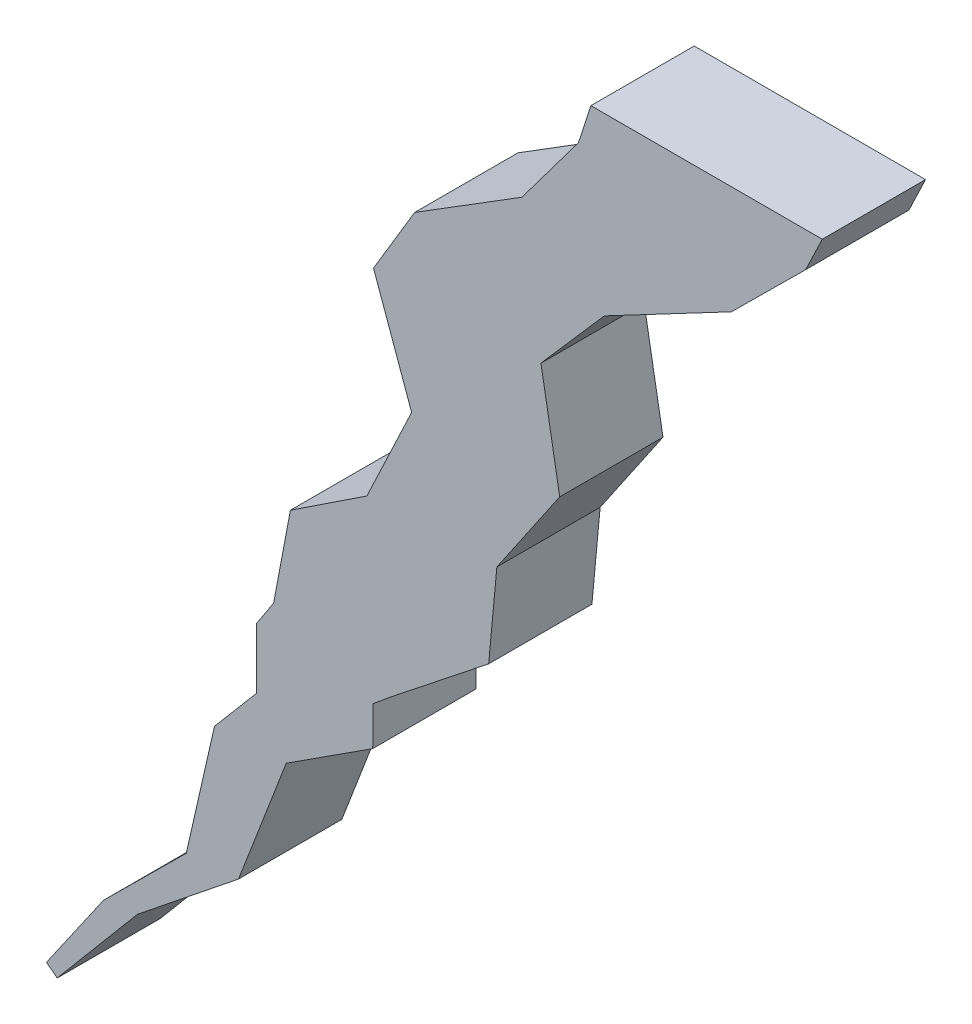
ISO-10303-21;
HEADER;
FILE_DESCRIPTION(('STEP AP214'),'2;1');
FILE_NAME('part.step','',(''),(''),'','','');
FILE_SCHEMA(('AUTOMOTIVE_DESIGN { 1 0 10303 214 1 1 1 1 }'));
ENDSEC;
DATA;
#1=APPLICATION_CONTEXT('core data for automotive mechanical design processes');
#2=APPLICATION_PROTOCOL_DEFINITION('international standard','automotive_design',2000,#1);
#3=PRODUCT_CONTEXT('',#1,'mechanical');
#4=PRODUCT('Part','Part','',(#3));
#5=PRODUCT_RELATED_PRODUCT_CATEGORY('part','',(#4));
#6=PRODUCT_DEFINITION_FORMATION('','',#4);
#7=PRODUCT_DEFINITION_CONTEXT('part definition',#1,'design');
#8=PRODUCT_DEFINITION('design','',#6,#7);
#9=PRODUCT_DEFINITION_SHAPE('','',#8);
#10=(LENGTH_UNIT() NAMED_UNIT(*) SI_UNIT(.MILLI.,.METRE.));
#11=(NAMED_UNIT(*) PLANE_ANGLE_UNIT() SI_UNIT($,.RADIAN.));
#12=(NAMED_UNIT(*) SI_UNIT($,.STERADIAN.) SOLID_ANGLE_UNIT());
#13=UNCERTAINTY_MEASURE_WITH_UNIT(LENGTH_MEASURE(1.E-05),#10,'distance_accuracy_value','');
#14=(GEOMETRIC_REPRESENTATION_CONTEXT(3) GLOBAL_UNCERTAINTY_ASSIGNED_CONTEXT((#13)) GLOBAL_UNIT_ASSIGNED_CONTEXT((#10,
#11,#12)) REPRESENTATION_CONTEXT('',''));
#15=CARTESIAN_POINT('',(0.,0.,0.));
#16=DIRECTION('',(0.,0.,1.));
#17=DIRECTION('',(1.,0.,0.));
#18=AXIS2_PLACEMENT_3D('',#15,#16,#17);
#19=CARTESIAN_POINT('',(15.949772023795,29.831204,3.));
#20=DIRECTION('',(0.,-1.,0.));
#21=DIRECTION('',(0.,0.,-1.));
#22=AXIS2_PLACEMENT_3D('',#19,#20,#21);
#23=PLANE('',#22);
#24=DIRECTION('',(-1.,0.,0.));
#25=VECTOR('',#24,1.);
#26=CARTESIAN_POINT('',(15.949772023795,29.831204,0.));
#27=LINE('',#26,#25);
#28=CARTESIAN_POINT('',(22.6696081865461,29.831204,0.));
#29=VERTEX_POINT('',#28);
#30=CARTESIAN_POINT('',(15.949772023795,29.831204,0.));
#31=VERTEX_POINT('',#30);
#32=EDGE_CURVE('E261',#29,#31,#27,.T.);
#33=ORIENTED_EDGE('',*,*,#32,.T.);
#34=DIRECTION('',(0.,0.,-1.));
#35=VECTOR('',#34,1.);
#36=CARTESIAN_POINT('',(15.949772023795,29.831204,3.));
#37=LINE('',#36,#35);
#38=CARTESIAN_POINT('',(15.949772023795,29.831204,3.));
#39=VERTEX_POINT('',#38);
#40=EDGE_CURVE('E11',#39,#31,#37,.T.);
#41=ORIENTED_EDGE('',*,*,#40,.F.);
#42=DIRECTION('',(-1.,0.,0.));
#43=VECTOR('',#42,1.);
#44=CARTESIAN_POINT('',(15.949772023795,29.831204,3.));
#45=LINE('',#44,#43);
#46=CARTESIAN_POINT('',(22.6696081865461,29.831204,3.));
#47=VERTEX_POINT('',#46);
#48=EDGE_CURVE('E319',#47,#39,#45,.T.);
#49=ORIENTED_EDGE('',*,*,#48,.F.);
#50=DIRECTION('',(0.,0.,-1.));
#51=VECTOR('',#50,1.);
#52=CARTESIAN_POINT('',(22.6696081865461,29.831204,3.));
#53=LINE('',#52,#51);
#54=EDGE_CURVE('E257',#47,#29,#53,.T.);
#55=ORIENTED_EDGE('',*,*,#54,.T.);
#56=EDGE_LOOP('',(#33,#41,#49,#55));
#57=FACE_BOUND('',#56,.T.);
#58=ADVANCED_FACE('F33',(#57),#23,.F.);
#59=CARTESIAN_POINT('',(15.5877255705261,28.7178437122339,3.));
#60=DIRECTION('',(0.950982744946045,-0.309243947094984,0.));
#61=DIRECTION('',(0.309243947094984,0.950982744946045,0.));
#62=AXIS2_PLACEMENT_3D('',#59,#60,#61);
#63=PLANE('',#62);
#64=DIRECTION('',(-0.309243947094984,-0.950982744946045,0.));
#65=VECTOR('',#64,1.);
#66=CARTESIAN_POINT('',(15.5877255705261,28.7178437122339,0.));
#67=LINE('',#66,#65);
#68=CARTESIAN_POINT('',(15.5877255705261,28.7178437122339,0.));
#69=VERTEX_POINT('',#68);
#70=EDGE_CURVE('E264',#31,#69,#67,.T.);
#71=ORIENTED_EDGE('',*,*,#70,.T.);
#72=DIRECTION('',(0.,0.,-1.));
#73=VECTOR('',#72,1.);
#74=CARTESIAN_POINT('',(15.5877255705261,28.7178437122339,3.));
#75=LINE('',#74,#73);
#76=CARTESIAN_POINT('',(15.5877255705261,28.7178437122339,3.));
#77=VERTEX_POINT('',#76);
#78=EDGE_CURVE('E41',#77,#69,#75,.T.);
#79=ORIENTED_EDGE('',*,*,#78,.F.);
#80=DIRECTION('',(-0.309243947094984,-0.950982744946045,0.));
#81=VECTOR('',#80,1.);
#82=CARTESIAN_POINT('',(15.5877255705261,28.7178437122339,3.));
#83=LINE('',#82,#81);
#84=EDGE_CURVE('E158',#39,#77,#83,.T.);
#85=ORIENTED_EDGE('',*,*,#84,.F.);
#86=ORIENTED_EDGE('',*,*,#40,.T.);
#87=EDGE_LOOP('',(#71,#79,#85,#86));
#88=FACE_BOUND('',#87,.T.);
#89=ADVANCED_FACE('F487',(#88),#63,.F.);
#90=CARTESIAN_POINT('',(13.9488355878805,26.5276676371434,3.));
#91=DIRECTION('',(0.800656150724203,-0.599124134305657,0.));
#92=DIRECTION('',(0.599124134305657,0.800656150724203,0.));
#93=AXIS2_PLACEMENT_3D('',#90,#91,#92);
#94=PLANE('',#93);
#95=DIRECTION('',(-0.599124134305657,-0.800656150724203,0.));
#96=VECTOR('',#95,1.);
#97=CARTESIAN_POINT('',(13.9488355878805,26.5276676371434,0.));
#98=LINE('',#97,#96);
#99=CARTESIAN_POINT('',(13.9488355878805,26.5276676371434,0.));
#100=VERTEX_POINT('',#99);
#101=EDGE_CURVE('E266',#69,#100,#98,.T.);
#102=ORIENTED_EDGE('',*,*,#101,.T.);
#103=DIRECTION('',(0.,0.,-1.));
#104=VECTOR('',#103,1.);
#105=CARTESIAN_POINT('',(13.9488355878805,26.5276676371434,3.));
#106=LINE('',#105,#104);
#107=CARTESIAN_POINT('',(13.9488355878805,26.5276676371434,3.));
#108=VERTEX_POINT('',#107);
#109=EDGE_CURVE('E392',#108,#100,#106,.T.);
#110=ORIENTED_EDGE('',*,*,#109,.F.);
#111=DIRECTION('',(-0.599124134305657,-0.800656150724203,0.));
#112=VECTOR('',#111,1.);
#113=CARTESIAN_POINT('',(13.9488355878805,26.5276676371434,3.));
#114=LINE('',#113,#112);
#115=EDGE_CURVE('E400',#77,#108,#114,.T.);
#116=ORIENTED_EDGE('',*,*,#115,.F.);
#117=ORIENTED_EDGE('',*,*,#78,.T.);
#118=EDGE_LOOP('',(#102,#110,#116,#117));
#119=FACE_BOUND('',#118,.T.);
#120=ADVANCED_FACE('F398',(#119),#94,.F.);
#121=CARTESIAN_POINT('',(10.8314122240594,24.5853584851001,3.));
#122=DIRECTION('',(0.528807983663958,-0.848741489744232,0.));
#123=DIRECTION('',(0.848741489744233,0.528807983663958,0.));
#124=AXIS2_PLACEMENT_3D('',#121,#122,#123);
#125=PLANE('',#124);
#126=DIRECTION('',(-0.848741489744233,-0.528807983663958,0.));
#127=VECTOR('',#126,1.);
#128=CARTESIAN_POINT('',(10.8314122240594,24.5853584851001,0.));
#129=LINE('',#128,#127);
#130=CARTESIAN_POINT('',(10.8314122240594,24.5853584851001,0.));
#131=VERTEX_POINT('',#130);
#132=EDGE_CURVE('E268',#100,#131,#129,.T.);
#133=ORIENTED_EDGE('',*,*,#132,.T.);
#134=DIRECTION('',(0.,0.,-1.));
#135=VECTOR('',#134,1.);
#136=CARTESIAN_POINT('',(10.8314122240594,24.5853584851001,3.));
#137=LINE('',#136,#135);
#138=CARTESIAN_POINT('',(10.8314122240594,24.5853584851001,3.));
#139=VERTEX_POINT('',#138);
#140=EDGE_CURVE('E389',#139,#131,#137,.T.);
#141=ORIENTED_EDGE('',*,*,#140,.F.);
#142=DIRECTION('',(-0.848741489744233,-0.528807983663958,0.));
#143=VECTOR('',#142,1.);
#144=CARTESIAN_POINT('',(10.8314122240594,24.5853584851001,3.));
#145=LINE('',#144,#143);
#146=EDGE_CURVE('E418',#108,#139,#145,.T.);
#147=ORIENTED_EDGE('',*,*,#146,.F.);
#148=ORIENTED_EDGE('',*,*,#109,.T.);
#149=EDGE_LOOP('',(#133,#141,#147,#148));
#150=FACE_BOUND('',#149,.T.);
#151=ADVANCED_FACE('F409',(#150),#125,.F.);
#152=CARTESIAN_POINT('',(9.63595958319933,22.5881278537821,3.));
#153=DIRECTION('',(0.858039391938375,-0.51358388008389,0.));
#154=DIRECTION('',(0.51358388008389,0.858039391938375,0.));
#155=AXIS2_PLACEMENT_3D('',#152,#153,#154);
#156=PLANE('',#155);
#157=DIRECTION('',(-0.51358388008389,-0.858039391938375,0.));
#158=VECTOR('',#157,1.);
#159=CARTESIAN_POINT('',(9.63595958319933,22.5881278537821,0.));
#160=LINE('',#159,#158);
#161=CARTESIAN_POINT('',(9.63595958319933,22.5881278537821,0.));
#162=VERTEX_POINT('',#161);
#163=EDGE_CURVE('E270',#131,#162,#160,.T.);
#164=ORIENTED_EDGE('',*,*,#163,.T.);
#165=DIRECTION('',(0.,0.,-1.));
#166=VECTOR('',#165,1.);
#167=CARTESIAN_POINT('',(9.63595958319933,22.5881278537821,3.));
#168=LINE('',#167,#166);
#169=CARTESIAN_POINT('',(9.63595958319933,22.5881278537821,3.));
#170=VERTEX_POINT('',#169);
#171=EDGE_CURVE('E386',#170,#162,#168,.T.);
#172=ORIENTED_EDGE('',*,*,#171,.F.);
#173=DIRECTION('',(-0.51358388008389,-0.858039391938375,0.));
#174=VECTOR('',#173,1.);
#175=CARTESIAN_POINT('',(9.63595958319933,22.5881278537821,3.));
#176=LINE('',#175,#174);
#177=EDGE_CURVE('E415',#139,#170,#176,.T.);
#178=ORIENTED_EDGE('',*,*,#177,.F.);
#179=ORIENTED_EDGE('',*,*,#140,.T.);
#180=EDGE_LOOP('',(#164,#172,#178,#179));
#181=FACE_BOUND('',#180,.T.);
#182=ADVANCED_FACE('F413',(#181),#156,.F.);
#183=CARTESIAN_POINT('',(10.7425999469709,19.5094708641594,3.));
#184=DIRECTION('',(0.941050586311647,0.338265862898557,0.));
#185=DIRECTION('',(-0.338265862898557,0.941050586311647,0.));
#186=AXIS2_PLACEMENT_3D('',#183,#184,#185);
#187=PLANE('',#186);
#188=DIRECTION('',(0.338265862898557,-0.941050586311647,0.));
#189=VECTOR('',#188,1.);
#190=CARTESIAN_POINT('',(10.7425999469709,19.5094708641594,0.));
#191=LINE('',#190,#189);
#192=CARTESIAN_POINT('',(10.7425999469709,19.5094708641594,0.));
#193=VERTEX_POINT('',#192);
#194=EDGE_CURVE('E272',#162,#193,#191,.T.);
#195=ORIENTED_EDGE('',*,*,#194,.T.);
#196=DIRECTION('',(0.,0.,-1.));
#197=VECTOR('',#196,1.);
#198=CARTESIAN_POINT('',(10.7425999469709,19.5094708641594,3.));
#199=LINE('',#198,#197);
#200=CARTESIAN_POINT('',(10.7425999469709,19.5094708641594,3.));
#201=VERTEX_POINT('',#200);
#202=EDGE_CURVE('E383',#201,#193,#199,.T.);
#203=ORIENTED_EDGE('',*,*,#202,.F.);
#204=DIRECTION('',(0.338265862898557,-0.941050586311647,0.));
#205=VECTOR('',#204,1.);
#206=CARTESIAN_POINT('',(10.7425999469709,19.5094708641594,3.));
#207=LINE('',#206,#205);
#208=EDGE_CURVE('E417',#170,#201,#207,.T.);
#209=ORIENTED_EDGE('',*,*,#208,.F.);
#210=ORIENTED_EDGE('',*,*,#171,.T.);
#211=EDGE_LOOP('',(#195,#203,#209,#210));
#212=FACE_BOUND('',#211,.T.);
#213=ADVANCED_FACE('F500',(#212),#187,.F.);
#214=CARTESIAN_POINT('',(9.44293921269338,16.7581525376982,3.));
#215=DIRECTION('',(0.904194445301833,-0.427121066075312,0.));
#216=DIRECTION('',(0.427121066075312,0.904194445301833,0.));
#217=AXIS2_PLACEMENT_3D('',#214,#215,#216);
#218=PLANE('',#217);
#219=DIRECTION('',(-0.427121066075312,-0.904194445301833,0.));
#220=VECTOR('',#219,1.);
#221=CARTESIAN_POINT('',(9.44293921269338,16.7581525376982,0.));
#222=LINE('',#221,#220);
#223=CARTESIAN_POINT('',(9.44293921269338,16.7581525376982,0.));
#224=VERTEX_POINT('',#223);
#225=EDGE_CURVE('E274',#193,#224,#222,.T.);
#226=ORIENTED_EDGE('',*,*,#225,.T.);
#227=DIRECTION('',(0.,0.,-1.));
#228=VECTOR('',#227,1.);
#229=CARTESIAN_POINT('',(9.44293921269338,16.7581525376982,3.));
#230=LINE('',#229,#228);
#231=CARTESIAN_POINT('',(9.44293921269338,16.7581525376982,3.));
#232=VERTEX_POINT('',#231);
#233=EDGE_CURVE('E380',#232,#224,#230,.T.);
#234=ORIENTED_EDGE('',*,*,#233,.F.);
#235=DIRECTION('',(-0.427121066075312,-0.904194445301833,0.));
#236=VECTOR('',#235,1.);
#237=CARTESIAN_POINT('',(9.44293921269338,16.7581525376982,3.));
#238=LINE('',#237,#236);
#239=EDGE_CURVE('E420',#201,#232,#238,.T.);
#240=ORIENTED_EDGE('',*,*,#239,.F.);
#241=ORIENTED_EDGE('',*,*,#202,.T.);
#242=EDGE_LOOP('',(#226,#234,#240,#241));
#243=FACE_BOUND('',#242,.T.);
#244=ADVANCED_FACE('F503',(#243),#218,.F.);
#245=CARTESIAN_POINT('',(7.22140834262423,15.289524307484,3.));
#246=DIRECTION('',(0.551474477361324,-0.834191765015128,0.));
#247=DIRECTION('',(0.834191765015128,0.551474477361324,0.));
#248=AXIS2_PLACEMENT_3D('',#245,#246,#247);
#249=PLANE('',#248);
#250=DIRECTION('',(-0.834191765015128,-0.551474477361324,0.));
#251=VECTOR('',#250,1.);
#252=CARTESIAN_POINT('',(7.22140834262423,15.289524307484,0.));
#253=LINE('',#252,#251);
#254=CARTESIAN_POINT('',(7.22140834262423,15.289524307484,0.));
#255=VERTEX_POINT('',#254);
#256=EDGE_CURVE('E276',#224,#255,#253,.T.);
#257=ORIENTED_EDGE('',*,*,#256,.T.);
#258=DIRECTION('',(0.,0.,-1.));
#259=VECTOR('',#258,1.);
#260=CARTESIAN_POINT('',(7.22140834262423,15.289524307484,3.));
#261=LINE('',#260,#259);
#262=CARTESIAN_POINT('',(7.22140834262423,15.289524307484,3.));
#263=VERTEX_POINT('',#262);
#264=EDGE_CURVE('E377',#263,#255,#261,.T.);
#265=ORIENTED_EDGE('',*,*,#264,.F.);
#266=DIRECTION('',(-0.834191765015128,-0.551474477361324,0.));
#267=VECTOR('',#266,1.);
#268=CARTESIAN_POINT('',(7.22140834262423,15.289524307484,3.));
#269=LINE('',#268,#267);
#270=EDGE_CURVE('E426',#232,#263,#269,.T.);
#271=ORIENTED_EDGE('',*,*,#270,.F.);
#272=ORIENTED_EDGE('',*,*,#233,.T.);
#273=EDGE_LOOP('',(#257,#265,#271,#272));
#274=FACE_BOUND('',#273,.T.);
#275=ADVANCED_FACE('F507',(#274),#249,.F.);
#276=CARTESIAN_POINT('',(6.73470511667702,12.7105591006477,3.));
#277=DIRECTION('',(0.982654293218846,-0.185446865755586,0.));
#278=DIRECTION('',(0.185446865755586,0.982654293218846,0.));
#279=AXIS2_PLACEMENT_3D('',#276,#277,#278);
#280=PLANE('',#279);
#281=DIRECTION('',(-0.185446865755586,-0.982654293218846,0.));
#282=VECTOR('',#281,1.);
#283=CARTESIAN_POINT('',(6.73470511667702,12.7105591006477,0.));
#284=LINE('',#283,#282);
#285=CARTESIAN_POINT('',(6.73470511667702,12.7105591006477,0.));
#286=VERTEX_POINT('',#285);
#287=EDGE_CURVE('E278',#255,#286,#284,.T.);
#288=ORIENTED_EDGE('',*,*,#287,.T.);
#289=DIRECTION('',(0.,0.,-1.));
#290=VECTOR('',#289,1.);
#291=CARTESIAN_POINT('',(6.73470511667702,12.7105591006477,3.));
#292=LINE('',#291,#290);
#293=CARTESIAN_POINT('',(6.73470511667702,12.7105591006477,3.));
#294=VERTEX_POINT('',#293);
#295=EDGE_CURVE('E374',#294,#286,#292,.T.);
#296=ORIENTED_EDGE('',*,*,#295,.F.);
#297=DIRECTION('',(-0.185446865755586,-0.982654293218846,0.));
#298=VECTOR('',#297,1.);
#299=CARTESIAN_POINT('',(6.73470511667702,12.7105591006477,3.));
#300=LINE('',#299,#298);
#301=EDGE_CURVE('E428',#263,#294,#300,.T.);
#302=ORIENTED_EDGE('',*,*,#301,.F.);
#303=ORIENTED_EDGE('',*,*,#264,.T.);
#304=EDGE_LOOP('',(#288,#296,#302,#303));
#305=FACE_BOUND('',#304,.T.);
#306=ADVANCED_FACE('F511',(#305),#280,.F.);
#307=CARTESIAN_POINT('',(6.23327213099305,11.9417480705209,3.));
#308=DIRECTION('',(0.837593404417132,-0.546294141353281,0.));
#309=DIRECTION('',(0.546294141353281,0.837593404417132,0.));
#310=AXIS2_PLACEMENT_3D('',#307,#308,#309);
#311=PLANE('',#310);
#312=DIRECTION('',(-0.546294141353281,-0.837593404417132,0.));
#313=VECTOR('',#312,1.);
#314=CARTESIAN_POINT('',(6.23327213099305,11.9417480705209,0.));
#315=LINE('',#314,#313);
#316=CARTESIAN_POINT('',(6.23327213099305,11.9417480705209,0.));
#317=VERTEX_POINT('',#316);
#318=EDGE_CURVE('E280',#286,#317,#315,.T.);
#319=ORIENTED_EDGE('',*,*,#318,.T.);
#320=DIRECTION('',(0.,0.,-1.));
#321=VECTOR('',#320,1.);
#322=CARTESIAN_POINT('',(6.23327213099305,11.9417480705209,3.));
#323=LINE('',#322,#321);
#324=CARTESIAN_POINT('',(6.23327213099305,11.9417480705209,3.));
#325=VERTEX_POINT('',#324);
#326=EDGE_CURVE('E371',#325,#317,#323,.T.);
#327=ORIENTED_EDGE('',*,*,#326,.F.);
#328=DIRECTION('',(-0.546294141353281,-0.837593404417132,0.));
#329=VECTOR('',#328,1.);
#330=CARTESIAN_POINT('',(6.23327213099305,11.9417480705209,3.));
#331=LINE('',#330,#329);
#332=EDGE_CURVE('E430',#294,#325,#331,.T.);
#333=ORIENTED_EDGE('',*,*,#332,.F.);
#334=ORIENTED_EDGE('',*,*,#295,.T.);
#335=EDGE_LOOP('',(#319,#327,#333,#334));
#336=FACE_BOUND('',#335,.T.);
#337=ADVANCED_FACE('F515',(#336),#311,.F.);
#338=CARTESIAN_POINT('',(6.24148893094831,10.1973427249836,3.));
#339=DIRECTION('',(0.999988906377396,0.00471032081058944,0.));
#340=DIRECTION('',(-0.00471032081058944,0.999988906377397,0.));
#341=AXIS2_PLACEMENT_3D('',#338,#339,#340);
#342=PLANE('',#341);
#343=DIRECTION('',(0.00471032081058944,-0.999988906377396,0.));
#344=VECTOR('',#343,1.);
#345=CARTESIAN_POINT('',(6.24148893094831,10.1973427249836,0.));
#346=LINE('',#345,#344);
#347=CARTESIAN_POINT('',(6.24148893094831,10.1973427249836,0.));
#348=VERTEX_POINT('',#347);
#349=EDGE_CURVE('E282',#317,#348,#346,.T.);
#350=ORIENTED_EDGE('',*,*,#349,.T.);
#351=DIRECTION('',(0.,0.,-1.));
#352=VECTOR('',#351,1.);
#353=CARTESIAN_POINT('',(6.24148893094831,10.1973427249836,3.));
#354=LINE('',#353,#352);
#355=CARTESIAN_POINT('',(6.24148893094831,10.1973427249836,3.));
#356=VERTEX_POINT('',#355);
#357=EDGE_CURVE('E368',#356,#348,#354,.T.);
#358=ORIENTED_EDGE('',*,*,#357,.F.);
#359=DIRECTION('',(0.00471032081058944,-0.999988906377396,0.));
#360=VECTOR('',#359,1.);
#361=CARTESIAN_POINT('',(6.24148893094831,10.1973427249836,3.));
#362=LINE('',#361,#360);
#363=EDGE_CURVE('E432',#325,#356,#362,.T.);
#364=ORIENTED_EDGE('',*,*,#363,.F.);
#365=ORIENTED_EDGE('',*,*,#326,.T.);
#366=EDGE_LOOP('',(#350,#358,#364,#365));
#367=FACE_BOUND('',#366,.T.);
#368=ADVANCED_FACE('F519',(#367),#342,.F.);
#369=CARTESIAN_POINT('',(5.01660290010822,8.75236092134175,3.));
#370=DIRECTION('',(0.762810924538223,-0.646621599859718,0.));
#371=DIRECTION('',(0.646621599859718,0.762810924538223,0.));
#372=AXIS2_PLACEMENT_3D('',#369,#370,#371);
#373=PLANE('',#372);
#374=DIRECTION('',(-0.646621599859718,-0.762810924538223,0.));
#375=VECTOR('',#374,1.);
#376=CARTESIAN_POINT('',(5.01660290010822,8.75236092134175,0.));
#377=LINE('',#376,#375);
#378=CARTESIAN_POINT('',(5.01660290010822,8.75236092134175,0.));
#379=VERTEX_POINT('',#378);
#380=EDGE_CURVE('E284',#348,#379,#377,.T.);
#381=ORIENTED_EDGE('',*,*,#380,.T.);
#382=DIRECTION('',(0.,0.,-1.));
#383=VECTOR('',#382,1.);
#384=CARTESIAN_POINT('',(5.01660290010822,8.75236092134175,3.));
#385=LINE('',#384,#383);
#386=CARTESIAN_POINT('',(5.01660290010822,8.75236092134175,3.));
#387=VERTEX_POINT('',#386);
#388=EDGE_CURVE('E365',#387,#379,#385,.T.);
#389=ORIENTED_EDGE('',*,*,#388,.F.);
#390=DIRECTION('',(-0.646621599859718,-0.762810924538223,0.));
#391=VECTOR('',#390,1.);
#392=CARTESIAN_POINT('',(5.01660290010822,8.75236092134175,3.));
#393=LINE('',#392,#391);
#394=EDGE_CURVE('E434',#356,#387,#393,.T.);
#395=ORIENTED_EDGE('',*,*,#394,.F.);
#396=ORIENTED_EDGE('',*,*,#357,.T.);
#397=EDGE_LOOP('',(#381,#389,#395,#396));
#398=FACE_BOUND('',#397,.T.);
#399=ADVANCED_FACE('F523',(#398),#373,.F.);
#400=CARTESIAN_POINT('',(4.19659471800526,5.14715647047948,3.));
#401=DIRECTION('',(0.975095226521856,-0.221786607382617,0.));
#402=DIRECTION('',(0.221786607382617,0.975095226521856,0.));
#403=AXIS2_PLACEMENT_3D('',#400,#401,#402);
#404=PLANE('',#403);
#405=DIRECTION('',(-0.221786607382617,-0.975095226521856,0.));
#406=VECTOR('',#405,1.);
#407=CARTESIAN_POINT('',(4.19659471800526,5.14715647047948,0.));
#408=LINE('',#407,#406);
#409=CARTESIAN_POINT('',(4.19659471800526,5.14715647047948,0.));
#410=VERTEX_POINT('',#409);
#411=EDGE_CURVE('E286',#379,#410,#408,.T.);
#412=ORIENTED_EDGE('',*,*,#411,.T.);
#413=DIRECTION('',(0.,0.,-1.));
#414=VECTOR('',#413,1.);
#415=CARTESIAN_POINT('',(4.19659471800526,5.14715647047948,3.));
#416=LINE('',#415,#414);
#417=CARTESIAN_POINT('',(4.19659471800526,5.14715647047948,3.));
#418=VERTEX_POINT('',#417);
#419=EDGE_CURVE('E362',#418,#410,#416,.T.);
#420=ORIENTED_EDGE('',*,*,#419,.F.);
#421=DIRECTION('',(-0.221786607382617,-0.975095226521856,0.));
#422=VECTOR('',#421,1.);
#423=CARTESIAN_POINT('',(4.19659471800526,5.14715647047948,3.));
#424=LINE('',#423,#422);
#425=EDGE_CURVE('E436',#387,#418,#424,.T.);
#426=ORIENTED_EDGE('',*,*,#425,.F.);
#427=ORIENTED_EDGE('',*,*,#388,.T.);
#428=EDGE_LOOP('',(#412,#420,#426,#427));
#429=FACE_BOUND('',#428,.T.);
#430=ADVANCED_FACE('F527',(#429),#404,.F.);
#431=CARTESIAN_POINT('',(1.79371063184771,2.76465521951103,3.));
#432=DIRECTION('',(0.704088548843439,-0.710112185071866,0.));
#433=DIRECTION('',(0.710112185071867,0.704088548843439,0.));
#434=AXIS2_PLACEMENT_3D('',#431,#432,#433);
#435=PLANE('',#434);
#436=DIRECTION('',(-0.710112185071867,-0.704088548843439,0.));
#437=VECTOR('',#436,1.);
#438=CARTESIAN_POINT('',(1.79371063184771,2.76465521951103,0.));
#439=LINE('',#438,#437);
#440=CARTESIAN_POINT('',(1.79371063184771,2.76465521951103,0.));
#441=VERTEX_POINT('',#440);
#442=EDGE_CURVE('E288',#410,#441,#439,.T.);
#443=ORIENTED_EDGE('',*,*,#442,.T.);
#444=DIRECTION('',(0.,0.,-1.));
#445=VECTOR('',#444,1.);
#446=CARTESIAN_POINT('',(1.79371063184771,2.76465521951103,3.));
#447=LINE('',#446,#445);
#448=CARTESIAN_POINT('',(1.79371063184771,2.76465521951103,3.));
#449=VERTEX_POINT('',#448);
#450=EDGE_CURVE('E359',#449,#441,#447,.T.);
#451=ORIENTED_EDGE('',*,*,#450,.F.);
#452=DIRECTION('',(-0.710112185071867,-0.704088548843439,0.));
#453=VECTOR('',#452,1.);
#454=CARTESIAN_POINT('',(1.79371063184771,2.76465521951103,3.));
#455=LINE('',#454,#453);
#456=EDGE_CURVE('E438',#418,#449,#455,.T.);
#457=ORIENTED_EDGE('',*,*,#456,.F.);
#458=ORIENTED_EDGE('',*,*,#419,.T.);
#459=EDGE_LOOP('',(#443,#451,#457,#458));
#460=FACE_BOUND('',#459,.T.);
#461=ADVANCED_FACE('F531',(#460),#435,.F.);
#462=CARTESIAN_POINT('',(0.136683146028456,0.375705993733812,3.));
#463=DIRECTION('',(0.821686492404938,-0.569939740849215,0.));
#464=DIRECTION('',(0.569939740849215,0.821686492404938,0.));
#465=AXIS2_PLACEMENT_3D('',#462,#463,#464);
#466=PLANE('',#465);
#467=DIRECTION('',(-0.569939740849215,-0.821686492404938,0.));
#468=VECTOR('',#467,1.);
#469=CARTESIAN_POINT('',(0.136683146028456,0.375705993733812,0.));
#470=LINE('',#469,#468);
#471=CARTESIAN_POINT('',(0.136683146028456,0.375705993733812,0.));
#472=VERTEX_POINT('',#471);
#473=EDGE_CURVE('E290',#441,#472,#470,.T.);
#474=ORIENTED_EDGE('',*,*,#473,.T.);
#475=DIRECTION('',(0.,0.,-1.));
#476=VECTOR('',#475,1.);
#477=CARTESIAN_POINT('',(0.136683146028456,0.375705993733812,3.));
#478=LINE('',#477,#476);
#479=CARTESIAN_POINT('',(0.136683146028456,0.375705993733812,3.));
#480=VERTEX_POINT('',#479);
#481=EDGE_CURVE('E356',#480,#472,#478,.T.);
#482=ORIENTED_EDGE('',*,*,#481,.F.);
#483=DIRECTION('',(-0.569939740849215,-0.821686492404938,0.));
#484=VECTOR('',#483,1.);
#485=CARTESIAN_POINT('',(0.136683146028456,0.375705993733812,3.));
#486=LINE('',#485,#484);
#487=EDGE_CURVE('E440',#449,#480,#486,.T.);
#488=ORIENTED_EDGE('',*,*,#487,.F.);
#489=ORIENTED_EDGE('',*,*,#450,.T.);
#490=EDGE_LOOP('',(#474,#482,#488,#489));
#491=FACE_BOUND('',#490,.T.);
#492=ADVANCED_FACE('F535',(#491),#466,.F.);
#493=CARTESIAN_POINT('',(0.449752744781016,0.137265818989442,3.));
#494=DIRECTION('',(0.605900043080881,0.795540783237784,0.));
#495=DIRECTION('',(-0.795540783237784,0.605900043080881,0.));
#496=AXIS2_PLACEMENT_3D('',#493,#494,#495);
#497=PLANE('',#496);
#498=DIRECTION('',(0.795540783237784,-0.605900043080881,0.));
#499=VECTOR('',#498,1.);
#500=CARTESIAN_POINT('',(0.449752744781016,0.137265818989442,0.));
#501=LINE('',#500,#499);
#502=CARTESIAN_POINT('',(0.449752744781016,0.137265818989442,0.));
#503=VERTEX_POINT('',#502);
#504=EDGE_CURVE('E292',#472,#503,#501,.T.);
#505=ORIENTED_EDGE('',*,*,#504,.T.);
#506=DIRECTION('',(0.,0.,-1.));
#507=VECTOR('',#506,1.);
#508=CARTESIAN_POINT('',(0.449752744781016,0.137265818989442,3.));
#509=LINE('',#508,#507);
#510=CARTESIAN_POINT('',(0.449752744781016,0.137265818989442,3.));
#511=VERTEX_POINT('',#510);
#512=EDGE_CURVE('E353',#511,#503,#509,.T.);
#513=ORIENTED_EDGE('',*,*,#512,.F.);
#514=DIRECTION('',(0.795540783237784,-0.605900043080881,0.));
#515=VECTOR('',#514,1.);
#516=CARTESIAN_POINT('',(0.449752744781016,0.137265818989442,3.));
#517=LINE('',#516,#515);
#518=EDGE_CURVE('E442',#480,#511,#517,.T.);
#519=ORIENTED_EDGE('',*,*,#518,.F.);
#520=ORIENTED_EDGE('',*,*,#481,.T.);
#521=EDGE_LOOP('',(#505,#513,#519,#520));
#522=FACE_BOUND('',#521,.T.);
#523=ADVANCED_FACE('F539',(#522),#497,.F.);
#524=CARTESIAN_POINT('',(2.7754588839858,2.90107934457723,3.));
#525=DIRECTION('',(-0.765145184558511,0.643857784411217,0.));
#526=DIRECTION('',(-0.643857784411217,-0.765145184558511,0.));
#527=AXIS2_PLACEMENT_3D('',#524,#525,#526);
#528=PLANE('',#527);
#529=DIRECTION('',(0.643857784411217,0.765145184558511,0.));
#530=VECTOR('',#529,1.);
#531=CARTESIAN_POINT('',(2.7754588839858,2.90107934457723,0.));
#532=LINE('',#531,#530);
#533=CARTESIAN_POINT('',(2.7754588839858,2.90107934457723,0.));
#534=VERTEX_POINT('',#533);
#535=EDGE_CURVE('E294',#503,#534,#532,.T.);
#536=ORIENTED_EDGE('',*,*,#535,.T.);
#537=DIRECTION('',(0.,0.,-1.));
#538=VECTOR('',#537,1.);
#539=CARTESIAN_POINT('',(2.7754588839858,2.90107934457723,3.));
#540=LINE('',#539,#538);
#541=CARTESIAN_POINT('',(2.7754588839858,2.90107934457723,3.));
#542=VERTEX_POINT('',#541);
#543=EDGE_CURVE('E350',#542,#534,#540,.T.);
#544=ORIENTED_EDGE('',*,*,#543,.F.);
#545=DIRECTION('',(0.643857784411217,0.765145184558511,0.));
#546=VECTOR('',#545,1.);
#547=CARTESIAN_POINT('',(2.7754588839858,2.90107934457723,3.));
#548=LINE('',#547,#546);
#549=EDGE_CURVE('E444',#511,#542,#548,.T.);
#550=ORIENTED_EDGE('',*,*,#549,.F.);
#551=ORIENTED_EDGE('',*,*,#512,.T.);
#552=EDGE_LOOP('',(#536,#544,#550,#551));
#553=FACE_BOUND('',#552,.T.);
#554=ADVANCED_FACE('F543',(#553),#528,.F.);
#555=CARTESIAN_POINT('',(5.7152156653269,5.25879016085925,3.));
#556=DIRECTION('',(-0.625650113125721,0.780103798186993,0.));
#557=DIRECTION('',(-0.780103798186993,-0.625650113125721,0.));
#558=AXIS2_PLACEMENT_3D('',#555,#556,#557);
#559=PLANE('',#558);
#560=DIRECTION('',(0.780103798186993,0.625650113125721,0.));
#561=VECTOR('',#560,1.);
#562=CARTESIAN_POINT('',(5.7152156653269,5.25879016085925,0.));
#563=LINE('',#562,#561);
#564=CARTESIAN_POINT('',(5.7152156653269,5.25879016085925,0.));
#565=VERTEX_POINT('',#564);
#566=EDGE_CURVE('E296',#534,#565,#563,.T.);
#567=ORIENTED_EDGE('',*,*,#566,.T.);
#568=DIRECTION('',(0.,0.,-1.));
#569=VECTOR('',#568,1.);
#570=CARTESIAN_POINT('',(5.7152156653269,5.25879016085925,3.));
#571=LINE('',#570,#569);
#572=CARTESIAN_POINT('',(5.7152156653269,5.25879016085925,3.));
#573=VERTEX_POINT('',#572);
#574=EDGE_CURVE('E347',#573,#565,#571,.T.);
#575=ORIENTED_EDGE('',*,*,#574,.F.);
#576=DIRECTION('',(0.780103798186993,0.625650113125721,0.));
#577=VECTOR('',#576,1.);
#578=CARTESIAN_POINT('',(5.7152156653269,5.25879016085925,3.));
#579=LINE('',#578,#577);
#580=EDGE_CURVE('E446',#542,#573,#579,.T.);
#581=ORIENTED_EDGE('',*,*,#580,.F.);
#582=ORIENTED_EDGE('',*,*,#543,.T.);
#583=EDGE_LOOP('',(#567,#575,#581,#582));
#584=FACE_BOUND('',#583,.T.);
#585=ADVANCED_FACE('F547',(#584),#559,.F.);
#586=CARTESIAN_POINT('',(7.10063535075942,8.86466579171885,3.));
#587=DIRECTION('',(-0.933471798474905,0.358650807125853,0.));
#588=DIRECTION('',(-0.358650807125853,-0.933471798474905,0.));
#589=AXIS2_PLACEMENT_3D('',#586,#587,#588);
#590=PLANE('',#589);
#591=DIRECTION('',(0.358650807125853,0.933471798474905,0.));
#592=VECTOR('',#591,1.);
#593=CARTESIAN_POINT('',(7.10063535075942,8.86466579171885,0.));
#594=LINE('',#593,#592);
#595=CARTESIAN_POINT('',(7.10063535075942,8.86466579171885,0.));
#596=VERTEX_POINT('',#595);
#597=EDGE_CURVE('E298',#565,#596,#594,.T.);
#598=ORIENTED_EDGE('',*,*,#597,.T.);
#599=DIRECTION('',(0.,0.,-1.));
#600=VECTOR('',#599,1.);
#601=CARTESIAN_POINT('',(7.10063535075942,8.86466579171885,3.));
#602=LINE('',#601,#600);
#603=CARTESIAN_POINT('',(7.10063535075942,8.86466579171885,3.));
#604=VERTEX_POINT('',#603);
#605=EDGE_CURVE('E344',#604,#596,#602,.T.);
#606=ORIENTED_EDGE('',*,*,#605,.F.);
#607=DIRECTION('',(0.358650807125853,0.933471798474905,0.));
#608=VECTOR('',#607,1.);
#609=CARTESIAN_POINT('',(7.10063535075942,8.86466579171885,3.));
#610=LINE('',#609,#608);
#611=EDGE_CURVE('E448',#573,#604,#610,.T.);
#612=ORIENTED_EDGE('',*,*,#611,.F.);
#613=ORIENTED_EDGE('',*,*,#574,.T.);
#614=EDGE_LOOP('',(#598,#606,#612,#613));
#615=FACE_BOUND('',#614,.T.);
#616=ADVANCED_FACE('F551',(#615),#590,.F.);
#617=CARTESIAN_POINT('',(9.61282878500642,10.4885012785058,3.));
#618=DIRECTION('',(-0.542850285813453,0.839829486974738,0.));
#619=DIRECTION('',(-0.839829486974739,-0.542850285813453,0.));
#620=AXIS2_PLACEMENT_3D('',#617,#618,#619);
#621=PLANE('',#620);
#622=DIRECTION('',(0.839829486974739,0.542850285813453,0.));
#623=VECTOR('',#622,1.);
#624=CARTESIAN_POINT('',(9.61282878500642,10.4885012785058,0.));
#625=LINE('',#624,#623);
#626=CARTESIAN_POINT('',(9.61282878500642,10.4885012785058,0.));
#627=VERTEX_POINT('',#626);
#628=EDGE_CURVE('E300',#596,#627,#625,.T.);
#629=ORIENTED_EDGE('',*,*,#628,.T.);
#630=DIRECTION('',(0.,0.,-1.));
#631=VECTOR('',#630,1.);
#632=CARTESIAN_POINT('',(9.61282878500642,10.4885012785058,3.));
#633=LINE('',#632,#631);
#634=CARTESIAN_POINT('',(9.61282878500642,10.4885012785058,3.));
#635=VERTEX_POINT('',#634);
#636=EDGE_CURVE('E341',#635,#627,#633,.T.);
#637=ORIENTED_EDGE('',*,*,#636,.F.);
#638=DIRECTION('',(0.839829486974739,0.542850285813453,0.));
#639=VECTOR('',#638,1.);
#640=CARTESIAN_POINT('',(9.61282878500642,10.4885012785058,3.));
#641=LINE('',#640,#639);
#642=EDGE_CURVE('E450',#604,#635,#641,.T.);
#643=ORIENTED_EDGE('',*,*,#642,.F.);
#644=ORIENTED_EDGE('',*,*,#605,.T.);
#645=EDGE_LOOP('',(#629,#637,#643,#644));
#646=FACE_BOUND('',#645,.T.);
#647=ADVANCED_FACE('F555',(#646),#621,.F.);
#648=CARTESIAN_POINT('',(9.62684810149207,11.6274090504026,3.));
#649=DIRECTION('',(-0.999924247456286,0.0123085071791426,0.));
#650=DIRECTION('',(-0.0123085071791426,-0.999924247456287,0.));
#651=AXIS2_PLACEMENT_3D('',#648,#649,#650);
#652=PLANE('',#651);
#653=DIRECTION('',(0.0123085071791426,0.999924247456287,0.));
#654=VECTOR('',#653,1.);
#655=CARTESIAN_POINT('',(9.62684810149207,11.6274090504026,0.));
#656=LINE('',#655,#654);
#657=CARTESIAN_POINT('',(9.62684810149207,11.6274090504026,0.));
#658=VERTEX_POINT('',#657);
#659=EDGE_CURVE('E302',#627,#658,#656,.T.);
#660=ORIENTED_EDGE('',*,*,#659,.T.);
#661=DIRECTION('',(0.,0.,-1.));
#662=VECTOR('',#661,1.);
#663=CARTESIAN_POINT('',(9.62684810149207,11.6274090504026,3.));
#664=LINE('',#663,#662);
#665=CARTESIAN_POINT('',(9.62684810149207,11.6274090504026,3.));
#666=VERTEX_POINT('',#665);
#667=EDGE_CURVE('E338',#666,#658,#664,.T.);
#668=ORIENTED_EDGE('',*,*,#667,.F.);
#669=DIRECTION('',(0.0123085071791426,0.999924247456287,0.));
#670=VECTOR('',#669,1.);
#671=CARTESIAN_POINT('',(9.62684810149207,11.6274090504026,3.));
#672=LINE('',#671,#670);
#673=EDGE_CURVE('E452',#635,#666,#672,.T.);
#674=ORIENTED_EDGE('',*,*,#673,.F.);
#675=ORIENTED_EDGE('',*,*,#636,.T.);
#676=EDGE_LOOP('',(#660,#668,#674,#675));
#677=FACE_BOUND('',#676,.T.);
#678=ADVANCED_FACE('F559',(#677),#652,.F.);
#679=CARTESIAN_POINT('',(10.1290697231154,12.044518615057,3.));
#680=DIRECTION('',(-0.63891029624012,0.769281244642271,0.));
#681=DIRECTION('',(-0.769281244642271,-0.63891029624012,0.));
#682=AXIS2_PLACEMENT_3D('',#679,#680,#681);
#683=PLANE('',#682);
#684=DIRECTION('',(0.769281244642271,0.63891029624012,0.));
#685=VECTOR('',#684,1.);
#686=CARTESIAN_POINT('',(10.1290697231154,12.044518615057,0.));
#687=LINE('',#686,#685);
#688=CARTESIAN_POINT('',(10.1290697231154,12.044518615057,0.));
#689=VERTEX_POINT('',#688);
#690=EDGE_CURVE('E304',#658,#689,#687,.T.);
#691=ORIENTED_EDGE('',*,*,#690,.T.);
#692=DIRECTION('',(0.,0.,-1.));
#693=VECTOR('',#692,1.);
#694=CARTESIAN_POINT('',(10.1290697231154,12.044518615057,3.));
#695=LINE('',#694,#693);
#696=CARTESIAN_POINT('',(10.1290697231154,12.044518615057,3.));
#697=VERTEX_POINT('',#696);
#698=EDGE_CURVE('E335',#697,#689,#695,.T.);
#699=ORIENTED_EDGE('',*,*,#698,.F.);
#700=DIRECTION('',(0.769281244642271,0.63891029624012,0.));
#701=VECTOR('',#700,1.);
#702=CARTESIAN_POINT('',(10.1290697231154,12.044518615057,3.));
#703=LINE('',#702,#701);
#704=EDGE_CURVE('E454',#666,#697,#703,.T.);
#705=ORIENTED_EDGE('',*,*,#704,.F.);
#706=ORIENTED_EDGE('',*,*,#667,.T.);
#707=EDGE_LOOP('',(#691,#699,#705,#706));
#708=FACE_BOUND('',#707,.T.);
#709=ADVANCED_FACE('F563',(#708),#683,.F.);
#710=CARTESIAN_POINT('',(12.9803038186479,14.3042740334178,3.));
#711=DIRECTION('',(-0.621130074872161,0.783707490132194,0.));
#712=DIRECTION('',(-0.783707490132194,-0.621130074872161,0.));
#713=AXIS2_PLACEMENT_3D('',#710,#711,#712);
#714=PLANE('',#713);
#715=DIRECTION('',(0.783707490132194,0.621130074872161,0.));
#716=VECTOR('',#715,1.);
#717=CARTESIAN_POINT('',(12.9803038186479,14.3042740334178,0.));
#718=LINE('',#717,#716);
#719=CARTESIAN_POINT('',(12.9803038186479,14.3042740334178,0.));
#720=VERTEX_POINT('',#719);
#721=EDGE_CURVE('E306',#689,#720,#718,.T.);
#722=ORIENTED_EDGE('',*,*,#721,.T.);
#723=DIRECTION('',(0.,0.,-1.));
#724=VECTOR('',#723,1.);
#725=CARTESIAN_POINT('',(12.9803038186479,14.3042740334178,3.));
#726=LINE('',#725,#724);
#727=CARTESIAN_POINT('',(12.9803038186479,14.3042740334178,3.));
#728=VERTEX_POINT('',#727);
#729=EDGE_CURVE('E332',#728,#720,#726,.T.);
#730=ORIENTED_EDGE('',*,*,#729,.F.);
#731=DIRECTION('',(0.783707490132194,0.621130074872161,0.));
#732=VECTOR('',#731,1.);
#733=CARTESIAN_POINT('',(12.9803038186479,14.3042740334178,3.));
#734=LINE('',#733,#732);
#735=EDGE_CURVE('E456',#697,#728,#734,.T.);
#736=ORIENTED_EDGE('',*,*,#735,.F.);
#737=ORIENTED_EDGE('',*,*,#698,.T.);
#738=EDGE_LOOP('',(#722,#730,#736,#737));
#739=FACE_BOUND('',#738,.T.);
#740=ADVANCED_FACE('F567',(#739),#714,.F.);
#741=CARTESIAN_POINT('',(13.2183164971395,16.8611583493144,3.));
#742=DIRECTION('',(-0.995695360914457,0.0926862894576545,0.));
#743=DIRECTION('',(-0.0926862894576545,-0.995695360914458,0.));
#744=AXIS2_PLACEMENT_3D('',#741,#742,#743);
#745=PLANE('',#744);
#746=DIRECTION('',(0.0926862894576545,0.995695360914458,0.));
#747=VECTOR('',#746,1.);
#748=CARTESIAN_POINT('',(13.2183164971395,16.8611583493144,0.));
#749=LINE('',#748,#747);
#750=CARTESIAN_POINT('',(13.2183164971395,16.8611583493144,0.));
#751=VERTEX_POINT('',#750);
#752=EDGE_CURVE('E308',#720,#751,#749,.T.);
#753=ORIENTED_EDGE('',*,*,#752,.T.);
#754=DIRECTION('',(0.,0.,-1.));
#755=VECTOR('',#754,1.);
#756=CARTESIAN_POINT('',(13.2183164971395,16.8611583493144,3.));
#757=LINE('',#756,#755);
#758=CARTESIAN_POINT('',(13.2183164971395,16.8611583493144,3.));
#759=VERTEX_POINT('',#758);
#760=EDGE_CURVE('E329',#759,#751,#757,.T.);
#761=ORIENTED_EDGE('',*,*,#760,.F.);
#762=DIRECTION('',(0.0926862894576545,0.995695360914458,0.));
#763=VECTOR('',#762,1.);
#764=CARTESIAN_POINT('',(13.2183164971395,16.8611583493144,3.));
#765=LINE('',#764,#763);
#766=EDGE_CURVE('E458',#728,#759,#765,.T.);
#767=ORIENTED_EDGE('',*,*,#766,.F.);
#768=ORIENTED_EDGE('',*,*,#729,.T.);
#769=EDGE_LOOP('',(#753,#761,#767,#768));
#770=FACE_BOUND('',#769,.T.);
#771=ADVANCED_FACE('F571',(#770),#745,.F.);
#772=CARTESIAN_POINT('',(15.044379602776,19.5374034618774,3.));
#773=DIRECTION('',(-0.826033275262048,0.563621351760074,0.));
#774=DIRECTION('',(-0.563621351760074,-0.826033275262048,0.));
#775=AXIS2_PLACEMENT_3D('',#772,#773,#774);
#776=PLANE('',#775);
#777=DIRECTION('',(0.563621351760074,0.826033275262048,0.));
#778=VECTOR('',#777,1.);
#779=CARTESIAN_POINT('',(15.044379602776,19.5374034618774,0.));
#780=LINE('',#779,#778);
#781=CARTESIAN_POINT('',(15.044379602776,19.5374034618774,0.));
#782=VERTEX_POINT('',#781);
#783=EDGE_CURVE('E310',#751,#782,#780,.T.);
#784=ORIENTED_EDGE('',*,*,#783,.T.);
#785=DIRECTION('',(0.,0.,-1.));
#786=VECTOR('',#785,1.);
#787=CARTESIAN_POINT('',(15.044379602776,19.5374034618774,3.));
#788=LINE('',#787,#786);
#789=CARTESIAN_POINT('',(15.044379602776,19.5374034618774,3.));
#790=VERTEX_POINT('',#789);
#791=EDGE_CURVE('E326',#790,#782,#788,.T.);
#792=ORIENTED_EDGE('',*,*,#791,.F.);
#793=DIRECTION('',(0.563621351760074,0.826033275262048,0.));
#794=VECTOR('',#793,1.);
#795=CARTESIAN_POINT('',(15.044379602776,19.5374034618774,3.));
#796=LINE('',#795,#794);
#797=EDGE_CURVE('E460',#759,#790,#796,.T.);
#798=ORIENTED_EDGE('',*,*,#797,.F.);
#799=ORIENTED_EDGE('',*,*,#760,.T.);
#800=EDGE_LOOP('',(#784,#792,#798,#799));
#801=FACE_BOUND('',#800,.T.);
#802=ADVANCED_FACE('F575',(#801),#776,.F.);
#803=CARTESIAN_POINT('',(14.4989651510095,22.6285808099304,3.));
#804=DIRECTION('',(-0.984788325491609,-0.173758320593384,0.));
#805=DIRECTION('',(0.173758320593384,-0.984788325491609,0.));
#806=AXIS2_PLACEMENT_3D('',#803,#804,#805);
#807=PLANE('',#806);
#808=DIRECTION('',(-0.173758320593384,0.984788325491609,0.));
#809=VECTOR('',#808,1.);
#810=CARTESIAN_POINT('',(14.4989651510095,22.6285808099304,0.));
#811=LINE('',#810,#809);
#812=CARTESIAN_POINT('',(14.4989651510095,22.6285808099304,0.));
#813=VERTEX_POINT('',#812);
#814=EDGE_CURVE('E312',#782,#813,#811,.T.);
#815=ORIENTED_EDGE('',*,*,#814,.T.);
#816=DIRECTION('',(0.,0.,-1.));
#817=VECTOR('',#816,1.);
#818=CARTESIAN_POINT('',(14.4989651510095,22.6285808099304,3.));
#819=LINE('',#818,#817);
#820=CARTESIAN_POINT('',(14.4989651510095,22.6285808099304,3.));
#821=VERTEX_POINT('',#820);
#822=EDGE_CURVE('E323',#821,#813,#819,.T.);
#823=ORIENTED_EDGE('',*,*,#822,.F.);
#824=DIRECTION('',(-0.173758320593384,0.984788325491609,0.));
#825=VECTOR('',#824,1.);
#826=CARTESIAN_POINT('',(14.4989651510095,22.6285808099304,3.));
#827=LINE('',#826,#825);
#828=EDGE_CURVE('E462',#790,#821,#827,.T.);
#829=ORIENTED_EDGE('',*,*,#828,.F.);
#830=ORIENTED_EDGE('',*,*,#791,.T.);
#831=EDGE_LOOP('',(#815,#823,#829,#830));
#832=FACE_BOUND('',#831,.T.);
#833=ADVANCED_FACE('F468',(#832),#807,.F.);
#834=CARTESIAN_POINT('',(16.3392658684523,24.7372177856411,3.));
#835=DIRECTION('',(-0.753418334697121,0.65754149142257,0.));
#836=DIRECTION('',(-0.65754149142257,-0.753418334697121,0.));
#837=AXIS2_PLACEMENT_3D('',#834,#835,#836);
#838=PLANE('',#837);
#839=DIRECTION('',(0.65754149142257,0.753418334697121,0.));
#840=VECTOR('',#839,1.);
#841=CARTESIAN_POINT('',(16.3392658684523,24.7372177856411,0.));
#842=LINE('',#841,#840);
#843=CARTESIAN_POINT('',(16.3392658684523,24.7372177856411,0.));
#844=VERTEX_POINT('',#843);
#845=EDGE_CURVE('E314',#813,#844,#842,.T.);
#846=ORIENTED_EDGE('',*,*,#845,.T.);
#847=DIRECTION('',(0.,0.,-1.));
#848=VECTOR('',#847,1.);
#849=CARTESIAN_POINT('',(16.3392658684523,24.7372177856411,3.));
#850=LINE('',#849,#848);
#851=CARTESIAN_POINT('',(16.3392658684523,24.7372177856411,3.));
#852=VERTEX_POINT('',#851);
#853=EDGE_CURVE('E252',#852,#844,#850,.T.);
#854=ORIENTED_EDGE('',*,*,#853,.F.);
#855=DIRECTION('',(0.65754149142257,0.753418334697121,0.));
#856=VECTOR('',#855,1.);
#857=CARTESIAN_POINT('',(16.3392658684523,24.7372177856411,3.));
#858=LINE('',#857,#856);
#859=EDGE_CURVE('E243',#821,#852,#858,.T.);
#860=ORIENTED_EDGE('',*,*,#859,.F.);
#861=ORIENTED_EDGE('',*,*,#822,.T.);
#862=EDGE_LOOP('',(#846,#854,#860,#861));
#863=FACE_BOUND('',#862,.T.);
#864=ADVANCED_FACE('F472',(#863),#838,.F.);
#865=CARTESIAN_POINT('',(20.0290057086656,26.6841173708481,3.));
#866=DIRECTION('',(-0.466671794666059,0.884430571646616,0.));
#867=DIRECTION('',(-0.884430571646616,-0.466671794666059,0.));
#868=AXIS2_PLACEMENT_3D('',#865,#866,#867);
#869=PLANE('',#868);
#870=DIRECTION('',(0.884430571646616,0.466671794666059,0.));
#871=VECTOR('',#870,1.);
#872=CARTESIAN_POINT('',(20.0290057086656,26.6841173708481,0.));
#873=LINE('',#872,#871);
#874=CARTESIAN_POINT('',(20.0290057086656,26.6841173708481,0.));
#875=VERTEX_POINT('',#874);
#876=EDGE_CURVE('E251',#844,#875,#873,.T.);
#877=ORIENTED_EDGE('',*,*,#876,.T.);
#878=DIRECTION('',(0.,0.,-1.));
#879=VECTOR('',#878,1.);
#880=CARTESIAN_POINT('',(20.0290057086656,26.6841173708481,3.));
#881=LINE('',#880,#879);
#882=CARTESIAN_POINT('',(20.0290057086656,26.6841173708481,3.));
#883=VERTEX_POINT('',#882);
#884=EDGE_CURVE('E248',#883,#875,#881,.T.);
#885=ORIENTED_EDGE('',*,*,#884,.F.);
#886=DIRECTION('',(0.884430571646616,0.466671794666059,0.));
#887=VECTOR('',#886,1.);
#888=CARTESIAN_POINT('',(20.0290057086656,26.6841173708481,3.));
#889=LINE('',#888,#887);
#890=EDGE_CURVE('E237',#852,#883,#889,.T.);
#891=ORIENTED_EDGE('',*,*,#890,.F.);
#892=ORIENTED_EDGE('',*,*,#853,.T.);
#893=EDGE_LOOP('',(#877,#885,#891,#892));
#894=FACE_BOUND('',#893,.T.);
#895=ADVANCED_FACE('F249',(#894),#869,.F.);
#896=CARTESIAN_POINT('',(22.1882544949341,28.8233011636364,3.));
#897=DIRECTION('',(-0.703798353652678,0.710399801094974,0.));
#898=DIRECTION('',(-0.710399801094974,-0.703798353652679,0.));
#899=AXIS2_PLACEMENT_3D('',#896,#897,#898);
#900=PLANE('',#899);
#901=DIRECTION('',(0.710399801094974,0.703798353652679,0.));
#902=VECTOR('',#901,1.);
#903=CARTESIAN_POINT('',(22.1882544949341,28.8233011636364,0.));
#904=LINE('',#903,#902);
#905=CARTESIAN_POINT('',(22.1882544949341,28.8233011636364,0.));
#906=VERTEX_POINT('',#905);
#907=EDGE_CURVE('E144',#875,#906,#904,.T.);
#908=ORIENTED_EDGE('',*,*,#907,.T.);
#909=DIRECTION('',(0.,0.,-1.));
#910=VECTOR('',#909,1.);
#911=CARTESIAN_POINT('',(22.1882544949341,28.8233011636364,3.));
#912=LINE('',#911,#910);
#913=CARTESIAN_POINT('',(22.1882544949341,28.8233011636364,3.));
#914=VERTEX_POINT('',#913);
#915=EDGE_CURVE('E253',#914,#906,#912,.T.);
#916=ORIENTED_EDGE('',*,*,#915,.F.);
#917=DIRECTION('',(0.710399801094974,0.703798353652679,0.));
#918=VECTOR('',#917,1.);
#919=CARTESIAN_POINT('',(22.1882544949341,28.8233011636364,3.));
#920=LINE('',#919,#918);
#921=EDGE_CURVE('E241',#883,#914,#920,.T.);
#922=ORIENTED_EDGE('',*,*,#921,.F.);
#923=ORIENTED_EDGE('',*,*,#884,.T.);
#924=EDGE_LOOP('',(#908,#916,#922,#923));
#925=FACE_BOUND('',#924,.T.);
#926=ADVANCED_FACE('F255',(#925),#900,.F.);
#927=CARTESIAN_POINT('',(22.6696081865461,29.831204,3.));
#928=DIRECTION('',(-0.902373415591362,0.430955007899873,0.));
#929=DIRECTION('',(-0.430955007899873,-0.902373415591362,0.));
#930=AXIS2_PLACEMENT_3D('',#927,#928,#929);
#931=PLANE('',#930);
#932=DIRECTION('',(0.430955007899873,0.902373415591362,0.));
#933=VECTOR('',#932,1.);
#934=CARTESIAN_POINT('',(22.6696081865461,29.831204,0.));
#935=LINE('',#934,#933);
#936=EDGE_CURVE('E150',#906,#29,#935,.T.);
#937=ORIENTED_EDGE('',*,*,#936,.T.);
#938=ORIENTED_EDGE('',*,*,#54,.F.);
#939=DIRECTION('',(0.430955007899873,0.902373415591362,0.));
#940=VECTOR('',#939,1.);
#941=CARTESIAN_POINT('',(22.6696081865461,29.831204,3.));
#942=LINE('',#941,#940);
#943=EDGE_CURVE('E49',#914,#47,#942,.T.);
#944=ORIENTED_EDGE('',*,*,#943,.F.);
#945=ORIENTED_EDGE('',*,*,#915,.T.);
#946=EDGE_LOOP('',(#937,#938,#944,#945));
#947=FACE_BOUND('',#946,.T.);
#948=ADVANCED_FACE('F476',(#947),#931,.F.);
#949=CARTESIAN_POINT('',(0.,0.,3.));
#950=DIRECTION('',(0.,0.,1.));
#951=DIRECTION('',(1.,0.,0.));
#952=AXIS2_PLACEMENT_3D('',#949,#950,#951);
#953=PLANE('',#952);
#954=ORIENTED_EDGE('',*,*,#48,.T.);
#955=ORIENTED_EDGE('',*,*,#84,.T.);
#956=ORIENTED_EDGE('',*,*,#115,.T.);
#957=ORIENTED_EDGE('',*,*,#146,.T.);
#958=ORIENTED_EDGE('',*,*,#177,.T.);
#959=ORIENTED_EDGE('',*,*,#208,.T.);
#960=ORIENTED_EDGE('',*,*,#239,.T.);
#961=ORIENTED_EDGE('',*,*,#270,.T.);
#962=ORIENTED_EDGE('',*,*,#301,.T.);
#963=ORIENTED_EDGE('',*,*,#332,.T.);
#964=ORIENTED_EDGE('',*,*,#363,.T.);
#965=ORIENTED_EDGE('',*,*,#394,.T.);
#966=ORIENTED_EDGE('',*,*,#425,.T.);
#967=ORIENTED_EDGE('',*,*,#456,.T.);
#968=ORIENTED_EDGE('',*,*,#487,.T.);
#969=ORIENTED_EDGE('',*,*,#518,.T.);
#970=ORIENTED_EDGE('',*,*,#549,.T.);
#971=ORIENTED_EDGE('',*,*,#580,.T.);
#972=ORIENTED_EDGE('',*,*,#611,.T.);
#973=ORIENTED_EDGE('',*,*,#642,.T.);
#974=ORIENTED_EDGE('',*,*,#673,.T.);
#975=ORIENTED_EDGE('',*,*,#704,.T.);
#976=ORIENTED_EDGE('',*,*,#735,.T.);
#977=ORIENTED_EDGE('',*,*,#766,.T.);
#978=ORIENTED_EDGE('',*,*,#797,.T.);
#979=ORIENTED_EDGE('',*,*,#828,.T.);
#980=ORIENTED_EDGE('',*,*,#859,.T.);
#981=ORIENTED_EDGE('',*,*,#890,.T.);
#982=ORIENTED_EDGE('',*,*,#921,.T.);
#983=ORIENTED_EDGE('',*,*,#943,.T.);
#984=EDGE_LOOP('',(#954,#955,#956,#957,#958,#959,#960,#961,#962,#963,#964,#965,#966,#967,#968,
#969,#970,#971,#972,#973,#974,#975,#976,#977,#978,#979,#980,#981,#982,#983));
#985=FACE_BOUND('',#984,.T.);
#986=ADVANCED_FACE('F239',(#985),#953,.T.);
#987=CARTESIAN_POINT('',(0.,0.,0.));
#988=DIRECTION('',(0.,0.,1.));
#989=DIRECTION('',(1.,0.,0.));
#990=AXIS2_PLACEMENT_3D('',#987,#988,#989);
#991=PLANE('',#990);
#992=ORIENTED_EDGE('',*,*,#32,.F.);
#993=ORIENTED_EDGE('',*,*,#936,.F.);
#994=ORIENTED_EDGE('',*,*,#907,.F.);
#995=ORIENTED_EDGE('',*,*,#876,.F.);
#996=ORIENTED_EDGE('',*,*,#845,.F.);
#997=ORIENTED_EDGE('',*,*,#814,.F.);
#998=ORIENTED_EDGE('',*,*,#783,.F.);
#999=ORIENTED_EDGE('',*,*,#752,.F.);
#1000=ORIENTED_EDGE('',*,*,#721,.F.);
#1001=ORIENTED_EDGE('',*,*,#690,.F.);
#1002=ORIENTED_EDGE('',*,*,#659,.F.);
#1003=ORIENTED_EDGE('',*,*,#628,.F.);
#1004=ORIENTED_EDGE('',*,*,#597,.F.);
#1005=ORIENTED_EDGE('',*,*,#566,.F.);
#1006=ORIENTED_EDGE('',*,*,#535,.F.);
#1007=ORIENTED_EDGE('',*,*,#504,.F.);
#1008=ORIENTED_EDGE('',*,*,#473,.F.);
#1009=ORIENTED_EDGE('',*,*,#442,.F.);
#1010=ORIENTED_EDGE('',*,*,#411,.F.);
#1011=ORIENTED_EDGE('',*,*,#380,.F.);
#1012=ORIENTED_EDGE('',*,*,#349,.F.);
#1013=ORIENTED_EDGE('',*,*,#318,.F.);
#1014=ORIENTED_EDGE('',*,*,#287,.F.);
#1015=ORIENTED_EDGE('',*,*,#256,.F.);
#1016=ORIENTED_EDGE('',*,*,#225,.F.);
#1017=ORIENTED_EDGE('',*,*,#194,.F.);
#1018=ORIENTED_EDGE('',*,*,#163,.F.);
#1019=ORIENTED_EDGE('',*,*,#132,.F.);
#1020=ORIENTED_EDGE('',*,*,#101,.F.);
#1021=ORIENTED_EDGE('',*,*,#70,.F.);
#1022=EDGE_LOOP('',(#992,#993,#994,#995,#996,#997,#998,#999,#1000,#1001,#1002,#1003,#1004,#1005,
#1006,#1007,#1008,#1009,#1010,#1011,#1012,#1013,#1014,#1015,#1016,#1017,#1018,#1019,#1020,#1021));
#1023=FACE_BOUND('',#1022,.T.);
#1024=ADVANCED_FACE('F404',(#1023),#991,.F.);
#1025=CLOSED_SHELL('',(#58,#89,#120,#151,#182,#213,#244,#275,#306,#337,#368,#399,#430,#461,#492,
#523,#554,#585,#616,#647,#678,#709,#740,#771,#802,#833,#864,#895,#926,#948,#986,#1024));
#1026=MANIFOLD_SOLID_BREP('B2',#1025);
#1027=ADVANCED_BREP_SHAPE_REPRESENTATION('',(#18,#1026),#14);
#1028=SHAPE_DEFINITION_REPRESENTATION(#9,#1027);
ENDSEC;
END-ISO-10303-21;
